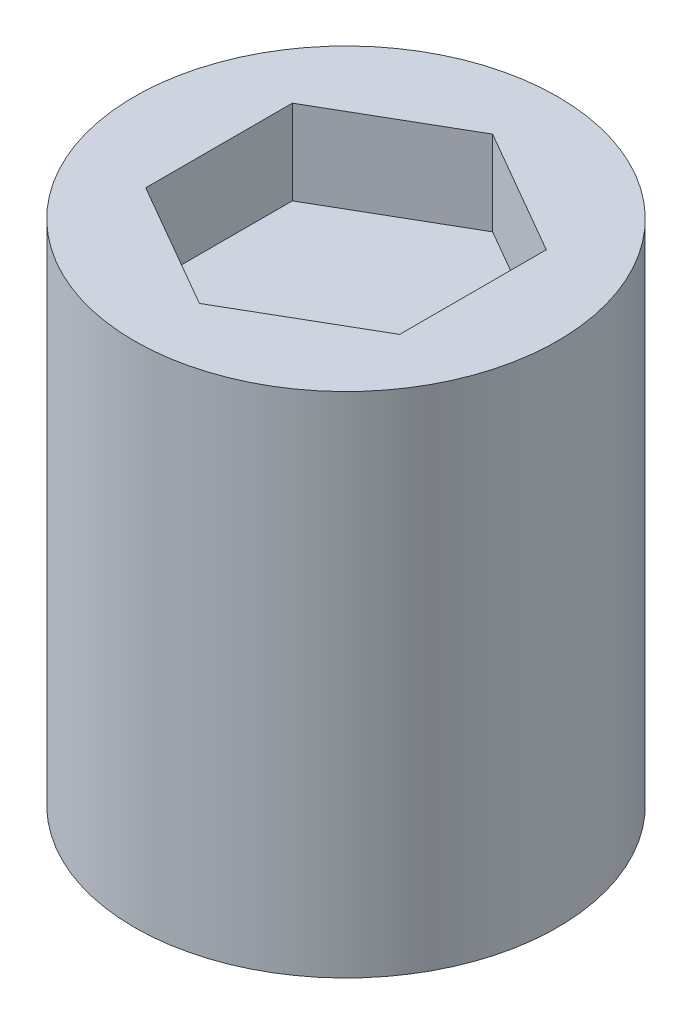
ISO-10303-21;
HEADER;
FILE_DESCRIPTION(('STEP AP214'),'2;1');
FILE_NAME('part.step','',(''),(''),'','','');
FILE_SCHEMA(('AUTOMOTIVE_DESIGN { 1 0 10303 214 1 1 1 1 }'));
ENDSEC;
DATA;
#1=APPLICATION_CONTEXT('core data for automotive mechanical design processes');
#2=APPLICATION_PROTOCOL_DEFINITION('international standard','automotive_design',2000,#1);
#3=PRODUCT_CONTEXT('',#1,'mechanical');
#4=PRODUCT('Part','Part','',(#3));
#5=PRODUCT_RELATED_PRODUCT_CATEGORY('part','',(#4));
#6=PRODUCT_DEFINITION_FORMATION('','',#4);
#7=PRODUCT_DEFINITION_CONTEXT('part definition',#1,'design');
#8=PRODUCT_DEFINITION('design','',#6,#7);
#9=PRODUCT_DEFINITION_SHAPE('','',#8);
#10=(LENGTH_UNIT() NAMED_UNIT(*) SI_UNIT(.MILLI.,.METRE.));
#11=(NAMED_UNIT(*) PLANE_ANGLE_UNIT() SI_UNIT($,.RADIAN.));
#12=(NAMED_UNIT(*) SI_UNIT($,.STERADIAN.) SOLID_ANGLE_UNIT());
#13=UNCERTAINTY_MEASURE_WITH_UNIT(LENGTH_MEASURE(1.E-05),#10,'distance_accuracy_value','');
#14=(GEOMETRIC_REPRESENTATION_CONTEXT(3) GLOBAL_UNCERTAINTY_ASSIGNED_CONTEXT((#13)) GLOBAL_UNIT_ASSIGNED_CONTEXT((#10,
#11,#12)) REPRESENTATION_CONTEXT('',''));
#15=CARTESIAN_POINT('',(0.,0.,0.));
#16=DIRECTION('',(0.,0.,1.));
#17=DIRECTION('',(1.,0.,0.));
#18=AXIS2_PLACEMENT_3D('',#15,#16,#17);
#19=CARTESIAN_POINT('',(0.,30.,0.));
#20=DIRECTION('',(0.,-1.,0.));
#21=DIRECTION('',(0.,0.,-1.));
#22=AXIS2_PLACEMENT_3D('',#19,#20,#21);
#23=CYLINDRICAL_SURFACE('',#22,12.5);
#24=CARTESIAN_POINT('',(0.,30.,0.));
#25=DIRECTION('',(0.,1.,0.));
#26=DIRECTION('',(0.,0.,1.));
#27=AXIS2_PLACEMENT_3D('',#24,#25,#26);
#28=CIRCLE('',#27,12.5);
#29=CARTESIAN_POINT('',(0.,30.,12.5));
#30=VERTEX_POINT('',#29);
#31=EDGE_CURVE('E11',#30,#30,#28,.T.);
#32=ORIENTED_EDGE('',*,*,#31,.F.);
#33=EDGE_LOOP('',(#32));
#34=FACE_BOUND('',#33,.T.);
#35=CARTESIAN_POINT('',(0.,0.,0.));
#36=DIRECTION('',(0.,1.,0.));
#37=DIRECTION('',(0.,0.,1.));
#38=AXIS2_PLACEMENT_3D('',#35,#36,#37);
#39=CIRCLE('',#38,12.5);
#40=CARTESIAN_POINT('',(0.,0.,12.5));
#41=VERTEX_POINT('',#40);
#42=EDGE_CURVE('E41',#41,#41,#39,.T.);
#43=ORIENTED_EDGE('',*,*,#42,.T.);
#44=EDGE_LOOP('',(#43));
#45=FACE_BOUND('',#44,.T.);
#46=ADVANCED_FACE('F33',(#34,#45),#23,.T.);
#47=CARTESIAN_POINT('',(0.,30.,0.));
#48=DIRECTION('',(0.,1.,0.));
#49=DIRECTION('',(0.,0.,1.));
#50=AXIS2_PLACEMENT_3D('',#47,#48,#49);
#51=PLANE('',#50);
#52=DIRECTION('',(-0.866025403784439,0.,-0.5));
#53=VECTOR('',#52,1.);
#54=CARTESIAN_POINT('',(7.5,30.,-4.3301270189222));
#55=LINE('',#54,#53);
#56=CARTESIAN_POINT('',(7.5,30.,-4.3301270189222));
#57=VERTEX_POINT('',#56);
#58=CARTESIAN_POINT('',(0.,30.,-8.66025403784439));
#59=VERTEX_POINT('',#58);
#60=EDGE_CURVE('E49',#57,#59,#55,.T.);
#61=ORIENTED_EDGE('',*,*,#60,.F.);
#62=DIRECTION('',(0.,0.,-1.));
#63=VECTOR('',#62,1.);
#64=CARTESIAN_POINT('',(7.5,30.,4.33012701892219));
#65=LINE('',#64,#63);
#66=CARTESIAN_POINT('',(7.5,30.,4.33012701892219));
#67=VERTEX_POINT('',#66);
#68=EDGE_CURVE('E121',#67,#57,#65,.T.);
#69=ORIENTED_EDGE('',*,*,#68,.F.);
#70=DIRECTION('',(0.866025403784439,0.,-0.5));
#71=VECTOR('',#70,1.);
#72=CARTESIAN_POINT('',(0.,30.,8.66025403784439));
#73=LINE('',#72,#71);
#74=CARTESIAN_POINT('',(0.,30.,8.66025403784439));
#75=VERTEX_POINT('',#74);
#76=EDGE_CURVE('E124',#75,#67,#73,.T.);
#77=ORIENTED_EDGE('',*,*,#76,.F.);
#78=DIRECTION('',(0.866025403784439,0.,0.5));
#79=VECTOR('',#78,1.);
#80=CARTESIAN_POINT('',(-7.5,30.,4.3301270189222));
#81=LINE('',#80,#79);
#82=CARTESIAN_POINT('',(-7.5,30.,4.3301270189222));
#83=VERTEX_POINT('',#82);
#84=EDGE_CURVE('E140',#83,#75,#81,.T.);
#85=ORIENTED_EDGE('',*,*,#84,.F.);
#86=DIRECTION('',(0.,0.,1.));
#87=VECTOR('',#86,1.);
#88=CARTESIAN_POINT('',(-7.5,30.,-4.33012701892219));
#89=LINE('',#88,#87);
#90=CARTESIAN_POINT('',(-7.5,30.,-4.33012701892219));
#91=VERTEX_POINT('',#90);
#92=EDGE_CURVE('E137',#91,#83,#89,.T.);
#93=ORIENTED_EDGE('',*,*,#92,.F.);
#94=DIRECTION('',(-0.866025403784438,0.,0.5));
#95=VECTOR('',#94,1.);
#96=CARTESIAN_POINT('',(0.,30.,-8.66025403784439));
#97=LINE('',#96,#95);
#98=EDGE_CURVE('E135',#59,#91,#97,.T.);
#99=ORIENTED_EDGE('',*,*,#98,.F.);
#100=EDGE_LOOP('',(#61,#69,#77,#85,#93,#99));
#101=FACE_BOUND('',#100,.T.);
#102=ORIENTED_EDGE('',*,*,#31,.T.);
#103=EDGE_LOOP('',(#102));
#104=FACE_BOUND('',#103,.T.);
#105=ADVANCED_FACE('F189',(#101,#104),#51,.T.);
#106=CARTESIAN_POINT('',(0.,0.,0.));
#107=DIRECTION('',(0.,1.,0.));
#108=DIRECTION('',(0.,0.,1.));
#109=AXIS2_PLACEMENT_3D('',#106,#107,#108);
#110=PLANE('',#109);
#111=CARTESIAN_POINT('',(0.,0.,0.));
#112=DIRECTION('',(0.,-1.,0.));
#113=DIRECTION('',(0.,0.,-1.));
#114=AXIS2_PLACEMENT_3D('',#111,#112,#113);
#115=CIRCLE('',#114,2.5);
#116=CARTESIAN_POINT('',(0.,0.,-2.5));
#117=VERTEX_POINT('',#116);
#118=EDGE_CURVE('E163',#117,#117,#115,.T.);
#119=ORIENTED_EDGE('',*,*,#118,.F.);
#120=EDGE_LOOP('',(#119));
#121=FACE_BOUND('',#120,.T.);
#122=ORIENTED_EDGE('',*,*,#42,.F.);
#123=EDGE_LOOP('',(#122));
#124=FACE_BOUND('',#123,.T.);
#125=ADVANCED_FACE('F186',(#121,#124),#110,.F.);
#126=CARTESIAN_POINT('',(0.,10.,0.));
#127=DIRECTION('',(0.,-1.,0.));
#128=DIRECTION('',(0.,0.,-1.));
#129=AXIS2_PLACEMENT_3D('',#126,#127,#128);
#130=CYLINDRICAL_SURFACE('',#129,2.5);
#131=CARTESIAN_POINT('',(0.,10.,0.));
#132=DIRECTION('',(0.,-1.,0.));
#133=DIRECTION('',(0.,0.,-1.));
#134=AXIS2_PLACEMENT_3D('',#131,#132,#133);
#135=CIRCLE('',#134,2.5);
#136=CARTESIAN_POINT('',(2.,10.,-1.5));
#137=VERTEX_POINT('',#136);
#138=CARTESIAN_POINT('',(2.,10.,1.5));
#139=VERTEX_POINT('',#138);
#140=EDGE_CURVE('E176',#137,#139,#135,.T.);
#141=ORIENTED_EDGE('',*,*,#140,.F.);
#142=DIRECTION('',(0.,-1.,0.));
#143=VECTOR('',#142,1.);
#144=CARTESIAN_POINT('',(2.,20.,-1.5));
#145=LINE('',#144,#143);
#146=CARTESIAN_POINT('',(2.,20.,-1.5));
#147=VERTEX_POINT('',#146);
#148=EDGE_CURVE('E57',#147,#137,#145,.T.);
#149=ORIENTED_EDGE('',*,*,#148,.F.);
#150=CARTESIAN_POINT('',(0.,20.,0.));
#151=DIRECTION('',(0.,-1.,0.));
#152=DIRECTION('',(0.,0.,-1.));
#153=AXIS2_PLACEMENT_3D('',#150,#151,#152);
#154=CIRCLE('',#153,2.5);
#155=CARTESIAN_POINT('',(2.,20.,1.5));
#156=VERTEX_POINT('',#155);
#157=EDGE_CURVE('E155',#156,#147,#154,.T.);
#158=ORIENTED_EDGE('',*,*,#157,.F.);
#159=DIRECTION('',(0.,-1.,0.));
#160=VECTOR('',#159,1.);
#161=CARTESIAN_POINT('',(2.,20.,1.5));
#162=LINE('',#161,#160);
#163=EDGE_CURVE('E170',#156,#139,#162,.T.);
#164=ORIENTED_EDGE('',*,*,#163,.T.);
#165=EDGE_LOOP('',(#141,#149,#158,#164));
#166=FACE_BOUND('',#165,.T.);
#167=ORIENTED_EDGE('',*,*,#118,.T.);
#168=EDGE_LOOP('',(#167));
#169=FACE_BOUND('',#168,.T.);
#170=ADVANCED_FACE('F188',(#166,#169),#130,.F.);
#171=CARTESIAN_POINT('',(0.,10.,0.));
#172=DIRECTION('',(0.,-1.,0.));
#173=DIRECTION('',(0.,0.,-1.));
#174=AXIS2_PLACEMENT_3D('',#171,#172,#173);
#175=PLANE('',#174);
#176=DIRECTION('',(0.,0.,1.));
#177=VECTOR('',#176,1.);
#178=CARTESIAN_POINT('',(2.,10.,1.5));
#179=LINE('',#178,#177);
#180=EDGE_CURVE('E147',#137,#139,#179,.T.);
#181=ORIENTED_EDGE('',*,*,#180,.F.);
#182=ORIENTED_EDGE('',*,*,#140,.T.);
#183=EDGE_LOOP('',(#181,#182));
#184=FACE_BOUND('',#183,.T.);
#185=ADVANCED_FACE('F195',(#184),#175,.T.);
#186=CARTESIAN_POINT('',(2.,20.,1.5));
#187=DIRECTION('',(1.,0.,0.));
#188=DIRECTION('',(0.,0.,-1.));
#189=AXIS2_PLACEMENT_3D('',#186,#187,#188);
#190=PLANE('',#189);
#191=ORIENTED_EDGE('',*,*,#180,.T.);
#192=ORIENTED_EDGE('',*,*,#163,.F.);
#193=DIRECTION('',(0.,0.,1.));
#194=VECTOR('',#193,1.);
#195=CARTESIAN_POINT('',(2.,20.,1.5));
#196=LINE('',#195,#194);
#197=EDGE_CURVE('E158',#147,#156,#196,.T.);
#198=ORIENTED_EDGE('',*,*,#197,.F.);
#199=ORIENTED_EDGE('',*,*,#148,.T.);
#200=EDGE_LOOP('',(#191,#192,#198,#199));
#201=FACE_BOUND('',#200,.T.);
#202=ADVANCED_FACE('F286',(#201),#190,.F.);
#203=CARTESIAN_POINT('',(0.,20.,0.));
#204=DIRECTION('',(0.,-1.,0.));
#205=DIRECTION('',(0.,0.,-1.));
#206=AXIS2_PLACEMENT_3D('',#203,#204,#205);
#207=PLANE('',#206);
#208=ORIENTED_EDGE('',*,*,#157,.T.);
#209=ORIENTED_EDGE('',*,*,#197,.T.);
#210=EDGE_LOOP('',(#208,#209));
#211=FACE_BOUND('',#210,.T.);
#212=ADVANCED_FACE('F216',(#211),#207,.T.);
#213=CARTESIAN_POINT('',(7.5,25.,-4.3301270189222));
#214=DIRECTION('',(0.5,0.,-0.866025403784439));
#215=DIRECTION('',(-0.866025403784439,0.,-0.5));
#216=AXIS2_PLACEMENT_3D('',#213,#214,#215);
#217=PLANE('',#216);
#218=ORIENTED_EDGE('',*,*,#60,.T.);
#219=DIRECTION('',(0.,1.,0.));
#220=VECTOR('',#219,1.);
#221=CARTESIAN_POINT('',(0.,25.,-8.66025403784439));
#222=LINE('',#221,#220);
#223=CARTESIAN_POINT('',(0.,25.,-8.66025403784439));
#224=VERTEX_POINT('',#223);
#225=EDGE_CURVE('E98',#224,#59,#222,.T.);
#226=ORIENTED_EDGE('',*,*,#225,.F.);
#227=DIRECTION('',(-0.866025403784439,0.,-0.5));
#228=VECTOR('',#227,1.);
#229=CARTESIAN_POINT('',(7.5,25.,-4.3301270189222));
#230=LINE('',#229,#228);
#231=CARTESIAN_POINT('',(7.5,25.,-4.3301270189222));
#232=VERTEX_POINT('',#231);
#233=EDGE_CURVE('E102',#232,#224,#230,.T.);
#234=ORIENTED_EDGE('',*,*,#233,.F.);
#235=DIRECTION('',(0.,1.,0.));
#236=VECTOR('',#235,1.);
#237=CARTESIAN_POINT('',(7.5,25.,-4.3301270189222));
#238=LINE('',#237,#236);
#239=EDGE_CURVE('E145',#232,#57,#238,.T.);
#240=ORIENTED_EDGE('',*,*,#239,.T.);
#241=EDGE_LOOP('',(#218,#226,#234,#240));
#242=FACE_BOUND('',#241,.T.);
#243=ADVANCED_FACE('F100',(#242),#217,.F.);
#244=CARTESIAN_POINT('',(7.5,25.,4.33012701892219));
#245=DIRECTION('',(1.,0.,0.));
#246=DIRECTION('',(0.,0.,-1.));
#247=AXIS2_PLACEMENT_3D('',#244,#245,#246);
#248=PLANE('',#247);
#249=ORIENTED_EDGE('',*,*,#68,.T.);
#250=ORIENTED_EDGE('',*,*,#239,.F.);
#251=DIRECTION('',(0.,0.,-1.));
#252=VECTOR('',#251,1.);
#253=CARTESIAN_POINT('',(7.5,25.,4.33012701892219));
#254=LINE('',#253,#252);
#255=CARTESIAN_POINT('',(7.5,25.,4.33012701892219));
#256=VERTEX_POINT('',#255);
#257=EDGE_CURVE('E108',#256,#232,#254,.T.);
#258=ORIENTED_EDGE('',*,*,#257,.F.);
#259=DIRECTION('',(0.,1.,0.));
#260=VECTOR('',#259,1.);
#261=CARTESIAN_POINT('',(7.5,25.,4.33012701892219));
#262=LINE('',#261,#260);
#263=EDGE_CURVE('E148',#256,#67,#262,.T.);
#264=ORIENTED_EDGE('',*,*,#263,.T.);
#265=EDGE_LOOP('',(#249,#250,#258,#264));
#266=FACE_BOUND('',#265,.T.);
#267=ADVANCED_FACE('F225',(#266),#248,.F.);
#268=CARTESIAN_POINT('',(0.,25.,8.66025403784439));
#269=DIRECTION('',(0.5,0.,0.866025403784439));
#270=DIRECTION('',(0.866025403784439,0.,-0.5));
#271=AXIS2_PLACEMENT_3D('',#268,#269,#270);
#272=PLANE('',#271);
#273=ORIENTED_EDGE('',*,*,#76,.T.);
#274=ORIENTED_EDGE('',*,*,#263,.F.);
#275=DIRECTION('',(0.866025403784439,0.,-0.5));
#276=VECTOR('',#275,1.);
#277=CARTESIAN_POINT('',(0.,25.,8.66025403784439));
#278=LINE('',#277,#276);
#279=CARTESIAN_POINT('',(0.,25.,8.66025403784439));
#280=VERTEX_POINT('',#279);
#281=EDGE_CURVE('E131',#280,#256,#278,.T.);
#282=ORIENTED_EDGE('',*,*,#281,.F.);
#283=DIRECTION('',(0.,1.,0.));
#284=VECTOR('',#283,1.);
#285=CARTESIAN_POINT('',(0.,25.,8.66025403784439));
#286=LINE('',#285,#284);
#287=EDGE_CURVE('E150',#280,#75,#286,.T.);
#288=ORIENTED_EDGE('',*,*,#287,.T.);
#289=EDGE_LOOP('',(#273,#274,#282,#288));
#290=FACE_BOUND('',#289,.T.);
#291=ADVANCED_FACE('F234',(#290),#272,.F.);
#292=CARTESIAN_POINT('',(-7.5,25.,4.3301270189222));
#293=DIRECTION('',(-0.5,0.,0.866025403784439));
#294=DIRECTION('',(0.866025403784439,0.,0.5));
#295=AXIS2_PLACEMENT_3D('',#292,#293,#294);
#296=PLANE('',#295);
#297=ORIENTED_EDGE('',*,*,#84,.T.);
#298=ORIENTED_EDGE('',*,*,#287,.F.);
#299=DIRECTION('',(0.866025403784439,0.,0.5));
#300=VECTOR('',#299,1.);
#301=CARTESIAN_POINT('',(-7.5,25.,4.3301270189222));
#302=LINE('',#301,#300);
#303=CARTESIAN_POINT('',(-7.5,25.,4.3301270189222));
#304=VERTEX_POINT('',#303);
#305=EDGE_CURVE('E128',#304,#280,#302,.T.);
#306=ORIENTED_EDGE('',*,*,#305,.F.);
#307=DIRECTION('',(0.,1.,0.));
#308=VECTOR('',#307,1.);
#309=CARTESIAN_POINT('',(-7.5,25.,4.3301270189222));
#310=LINE('',#309,#308);
#311=EDGE_CURVE('E152',#304,#83,#310,.T.);
#312=ORIENTED_EDGE('',*,*,#311,.T.);
#313=EDGE_LOOP('',(#297,#298,#306,#312));
#314=FACE_BOUND('',#313,.T.);
#315=ADVANCED_FACE('F244',(#314),#296,.F.);
#316=CARTESIAN_POINT('',(-7.5,25.,-4.33012701892219));
#317=DIRECTION('',(-1.,0.,0.));
#318=DIRECTION('',(0.,0.,1.));
#319=AXIS2_PLACEMENT_3D('',#316,#317,#318);
#320=PLANE('',#319);
#321=ORIENTED_EDGE('',*,*,#92,.T.);
#322=ORIENTED_EDGE('',*,*,#311,.F.);
#323=DIRECTION('',(0.,0.,1.));
#324=VECTOR('',#323,1.);
#325=CARTESIAN_POINT('',(-7.5,25.,-4.33012701892219));
#326=LINE('',#325,#324);
#327=CARTESIAN_POINT('',(-7.5,25.,-4.33012701892219));
#328=VERTEX_POINT('',#327);
#329=EDGE_CURVE('E116',#328,#304,#326,.T.);
#330=ORIENTED_EDGE('',*,*,#329,.F.);
#331=DIRECTION('',(0.,1.,0.));
#332=VECTOR('',#331,1.);
#333=CARTESIAN_POINT('',(-7.5,25.,-4.33012701892219));
#334=LINE('',#333,#332);
#335=EDGE_CURVE('E107',#328,#91,#334,.T.);
#336=ORIENTED_EDGE('',*,*,#335,.T.);
#337=EDGE_LOOP('',(#321,#322,#330,#336));
#338=FACE_BOUND('',#337,.T.);
#339=ADVANCED_FACE('F254',(#338),#320,.F.);
#340=CARTESIAN_POINT('',(0.,25.,-8.66025403784439));
#341=DIRECTION('',(-0.5,0.,-0.866025403784438));
#342=DIRECTION('',(-0.866025403784439,0.,0.5));
#343=AXIS2_PLACEMENT_3D('',#340,#341,#342);
#344=PLANE('',#343);
#345=ORIENTED_EDGE('',*,*,#98,.T.);
#346=ORIENTED_EDGE('',*,*,#335,.F.);
#347=DIRECTION('',(-0.866025403784438,0.,0.5));
#348=VECTOR('',#347,1.);
#349=CARTESIAN_POINT('',(0.,25.,-8.66025403784439));
#350=LINE('',#349,#348);
#351=EDGE_CURVE('E111',#224,#328,#350,.T.);
#352=ORIENTED_EDGE('',*,*,#351,.F.);
#353=ORIENTED_EDGE('',*,*,#225,.T.);
#354=EDGE_LOOP('',(#345,#346,#352,#353));
#355=FACE_BOUND('',#354,.T.);
#356=ADVANCED_FACE('F112',(#355),#344,.F.);
#357=CARTESIAN_POINT('',(0.,25.,0.));
#358=DIRECTION('',(0.,1.,0.));
#359=DIRECTION('',(0.,0.,1.));
#360=AXIS2_PLACEMENT_3D('',#357,#358,#359);
#361=PLANE('',#360);
#362=ORIENTED_EDGE('',*,*,#233,.T.);
#363=ORIENTED_EDGE('',*,*,#351,.T.);
#364=ORIENTED_EDGE('',*,*,#329,.T.);
#365=ORIENTED_EDGE('',*,*,#305,.T.);
#366=ORIENTED_EDGE('',*,*,#281,.T.);
#367=ORIENTED_EDGE('',*,*,#257,.T.);
#368=EDGE_LOOP('',(#362,#363,#364,#365,#366,#367));
#369=FACE_BOUND('',#368,.T.);
#370=ADVANCED_FACE('F118',(#369),#361,.T.);
#371=CLOSED_SHELL('',(#46,#105,#125,#170,#185,#202,#212,#243,#267,#291,#315,#339,#356,#370));
#372=MANIFOLD_SOLID_BREP('B2',#371);
#373=ADVANCED_BREP_SHAPE_REPRESENTATION('',(#18,#372),#14);
#374=SHAPE_DEFINITION_REPRESENTATION(#9,#373);
ENDSEC;
END-ISO-10303-21;
